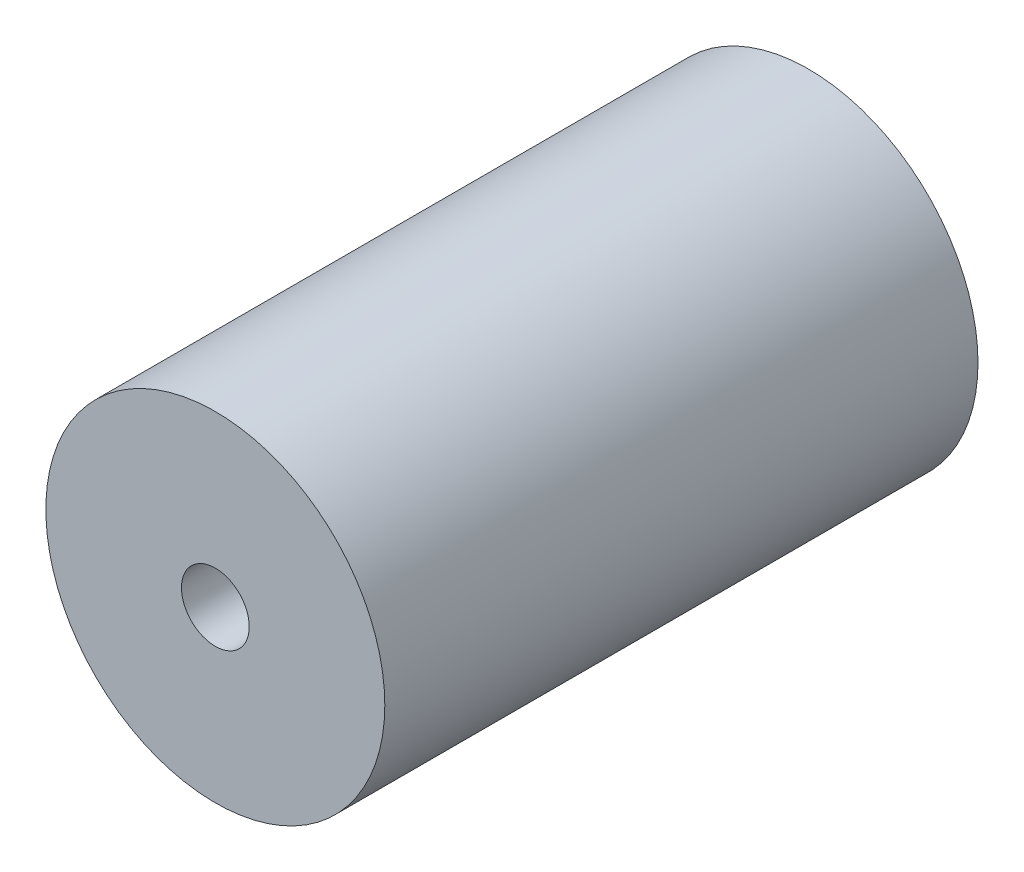
ISO-10303-21;
HEADER;
FILE_DESCRIPTION(('STEP AP214'),'2;1');
FILE_NAME('part.step','',(''),(''),'','','');
FILE_SCHEMA(('AUTOMOTIVE_DESIGN { 1 0 10303 214 1 1 1 1 }'));
ENDSEC;
DATA;
#1=APPLICATION_CONTEXT('core data for automotive mechanical design processes');
#2=APPLICATION_PROTOCOL_DEFINITION('international standard','automotive_design',2000,#1);
#3=PRODUCT_CONTEXT('',#1,'mechanical');
#4=PRODUCT('Part','Part','',(#3));
#5=PRODUCT_RELATED_PRODUCT_CATEGORY('part','',(#4));
#6=PRODUCT_DEFINITION_FORMATION('','',#4);
#7=PRODUCT_DEFINITION_CONTEXT('part definition',#1,'design');
#8=PRODUCT_DEFINITION('design','',#6,#7);
#9=PRODUCT_DEFINITION_SHAPE('','',#8);
#10=(LENGTH_UNIT() NAMED_UNIT(*) SI_UNIT(.MILLI.,.METRE.));
#11=(NAMED_UNIT(*) PLANE_ANGLE_UNIT() SI_UNIT($,.RADIAN.));
#12=(NAMED_UNIT(*) SI_UNIT($,.STERADIAN.) SOLID_ANGLE_UNIT());
#13=UNCERTAINTY_MEASURE_WITH_UNIT(LENGTH_MEASURE(1.E-05),#10,'distance_accuracy_value','');
#14=(GEOMETRIC_REPRESENTATION_CONTEXT(3) GLOBAL_UNCERTAINTY_ASSIGNED_CONTEXT((#13)) GLOBAL_UNIT_ASSIGNED_CONTEXT((#10,
#11,#12)) REPRESENTATION_CONTEXT('',''));
#15=CARTESIAN_POINT('',(0.,0.,0.));
#16=DIRECTION('',(0.,0.,1.));
#17=DIRECTION('',(1.,0.,0.));
#18=AXIS2_PLACEMENT_3D('',#15,#16,#17);
#19=CARTESIAN_POINT('',(0.,0.,35.));
#20=DIRECTION('',(0.,0.,1.));
#21=DIRECTION('',(1.,0.,0.));
#22=AXIS2_PLACEMENT_3D('',#19,#20,#21);
#23=PLANE('',#22);
#24=CARTESIAN_POINT('',(0.,0.,35.));
#25=DIRECTION('',(0.,0.,1.));
#26=DIRECTION('',(1.,0.,0.));
#27=AXIS2_PLACEMENT_3D('',#24,#25,#26);
#28=CIRCLE('',#27,10.);
#29=CARTESIAN_POINT('',(10.,0.,35.));
#30=VERTEX_POINT('',#29);
#31=EDGE_CURVE('E11',#30,#30,#28,.T.);
#32=ORIENTED_EDGE('',*,*,#31,.T.);
#33=EDGE_LOOP('',(#32));
#34=FACE_BOUND('',#33,.T.);
#35=CARTESIAN_POINT('',(0.,0.,35.));
#36=DIRECTION('',(0.,0.,1.));
#37=DIRECTION('',(1.,0.,0.));
#38=AXIS2_PLACEMENT_3D('',#35,#36,#37);
#39=CIRCLE('',#38,2.);
#40=CARTESIAN_POINT('',(2.,0.,35.));
#41=VERTEX_POINT('',#40);
#42=EDGE_CURVE('E56',#41,#41,#39,.T.);
#43=ORIENTED_EDGE('',*,*,#42,.F.);
#44=EDGE_LOOP('',(#43));
#45=FACE_BOUND('',#44,.T.);
#46=ADVANCED_FACE('F43',(#34,#45),#23,.T.);
#47=CARTESIAN_POINT('',(0.,0.,0.));
#48=DIRECTION('',(0.,0.,1.));
#49=DIRECTION('',(1.,0.,0.));
#50=AXIS2_PLACEMENT_3D('',#47,#48,#49);
#51=PLANE('',#50);
#52=CARTESIAN_POINT('',(0.,0.,0.));
#53=DIRECTION('',(0.,0.,1.));
#54=DIRECTION('',(1.,0.,0.));
#55=AXIS2_PLACEMENT_3D('',#52,#53,#54);
#56=CIRCLE('',#55,10.);
#57=CARTESIAN_POINT('',(10.,0.,0.));
#58=VERTEX_POINT('',#57);
#59=EDGE_CURVE('E47',#58,#58,#56,.T.);
#60=ORIENTED_EDGE('',*,*,#59,.F.);
#61=EDGE_LOOP('',(#60));
#62=FACE_BOUND('',#61,.T.);
#63=CARTESIAN_POINT('',(0.,0.,0.));
#64=DIRECTION('',(0.,0.,1.));
#65=DIRECTION('',(1.,0.,0.));
#66=AXIS2_PLACEMENT_3D('',#63,#64,#65);
#67=CIRCLE('',#66,2.);
#68=CARTESIAN_POINT('',(2.,0.,0.));
#69=VERTEX_POINT('',#68);
#70=EDGE_CURVE('E58',#69,#69,#67,.T.);
#71=ORIENTED_EDGE('',*,*,#70,.T.);
#72=EDGE_LOOP('',(#71));
#73=FACE_BOUND('',#72,.T.);
#74=ADVANCED_FACE('F70',(#62,#73),#51,.F.);
#75=CARTESIAN_POINT('',(0.,0.,35.));
#76=DIRECTION('',(0.,0.,-1.));
#77=DIRECTION('',(-1.,0.,0.));
#78=AXIS2_PLACEMENT_3D('',#75,#76,#77);
#79=CYLINDRICAL_SURFACE('',#78,10.);
#80=ORIENTED_EDGE('',*,*,#31,.F.);
#81=EDGE_LOOP('',(#80));
#82=FACE_BOUND('',#81,.T.);
#83=ORIENTED_EDGE('',*,*,#59,.T.);
#84=EDGE_LOOP('',(#83));
#85=FACE_BOUND('',#84,.T.);
#86=ADVANCED_FACE('F45',(#82,#85),#79,.T.);
#87=CARTESIAN_POINT('',(0.,0.,35.));
#88=DIRECTION('',(0.,0.,-1.));
#89=DIRECTION('',(-1.,0.,0.));
#90=AXIS2_PLACEMENT_3D('',#87,#88,#89);
#91=CYLINDRICAL_SURFACE('',#90,2.);
#92=ORIENTED_EDGE('',*,*,#42,.T.);
#93=EDGE_LOOP('',(#92));
#94=FACE_BOUND('',#93,.T.);
#95=ORIENTED_EDGE('',*,*,#70,.F.);
#96=EDGE_LOOP('',(#95));
#97=FACE_BOUND('',#96,.T.);
#98=ADVANCED_FACE('F66',(#94,#97),#91,.F.);
#99=CLOSED_SHELL('',(#46,#74,#86,#98));
#100=MANIFOLD_SOLID_BREP('B2',#99);
#101=ADVANCED_BREP_SHAPE_REPRESENTATION('',(#18,#100),#14);
#102=SHAPE_DEFINITION_REPRESENTATION(#9,#101);
ENDSEC;
END-ISO-10303-21;
